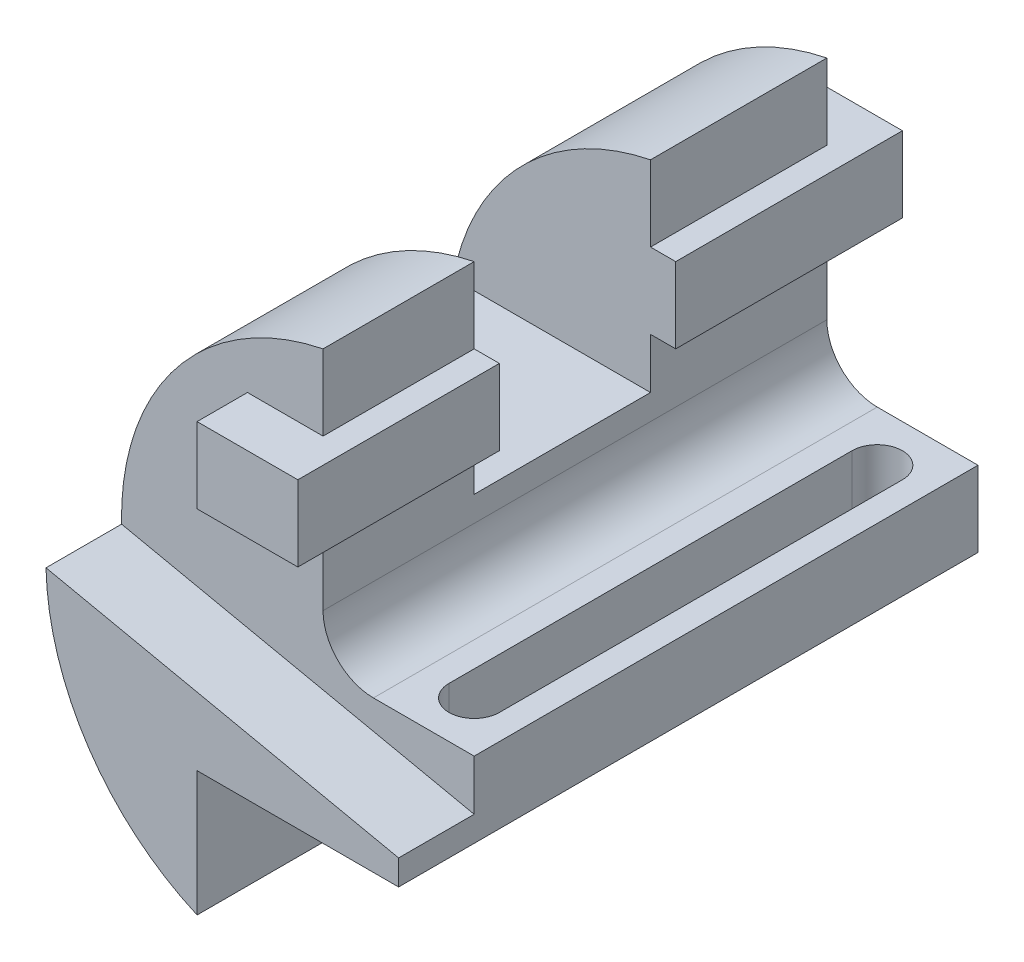
ISO-10303-21;
HEADER;
FILE_DESCRIPTION(('STEP AP214'),'2;1');
FILE_NAME('part.step','',(''),(''),'','','');
FILE_SCHEMA(('AUTOMOTIVE_DESIGN { 1 0 10303 214 1 1 1 1 }'));
ENDSEC;
DATA;
#1=APPLICATION_CONTEXT('core data for automotive mechanical design processes');
#2=APPLICATION_PROTOCOL_DEFINITION('international standard','automotive_design',2000,#1);
#3=PRODUCT_CONTEXT('',#1,'mechanical');
#4=PRODUCT('Part','Part','',(#3));
#5=PRODUCT_RELATED_PRODUCT_CATEGORY('part','',(#4));
#6=PRODUCT_DEFINITION_FORMATION('','',#4);
#7=PRODUCT_DEFINITION_CONTEXT('part definition',#1,'design');
#8=PRODUCT_DEFINITION('design','',#6,#7);
#9=PRODUCT_DEFINITION_SHAPE('','',#8);
#10=(LENGTH_UNIT() NAMED_UNIT(*) SI_UNIT(.MILLI.,.METRE.));
#11=(NAMED_UNIT(*) PLANE_ANGLE_UNIT() SI_UNIT($,.RADIAN.));
#12=(NAMED_UNIT(*) SI_UNIT($,.STERADIAN.) SOLID_ANGLE_UNIT());
#13=UNCERTAINTY_MEASURE_WITH_UNIT(LENGTH_MEASURE(1.E-05),#10,'distance_accuracy_value','');
#14=(GEOMETRIC_REPRESENTATION_CONTEXT(3) GLOBAL_UNCERTAINTY_ASSIGNED_CONTEXT((#13)) GLOBAL_UNIT_ASSIGNED_CONTEXT((#10,
#11,#12)) REPRESENTATION_CONTEXT('',''));
#15=CARTESIAN_POINT('',(0.,0.,0.));
#16=DIRECTION('',(0.,0.,1.));
#17=DIRECTION('',(1.,0.,0.));
#18=AXIS2_PLACEMENT_3D('',#15,#16,#17);
#19=CARTESIAN_POINT('',(-30.,25.0000000000001,115.));
#20=DIRECTION('',(-1.,0.,0.));
#21=DIRECTION('',(0.,-1.,0.));
#22=AXIS2_PLACEMENT_3D('',#19,#20,#21);
#23=PLANE('',#22);
#24=DIRECTION('',(0.,0.,1.));
#25=VECTOR('',#24,1.);
#26=CARTESIAN_POINT('',(-30.,55.,115.));
#27=LINE('',#26,#25);
#28=CARTESIAN_POINT('',(-30.,55.,70.));
#29=VERTEX_POINT('',#28);
#30=CARTESIAN_POINT('',(-30.,55.,100.));
#31=VERTEX_POINT('',#30);
#32=EDGE_CURVE('E328',#29,#31,#27,.T.);
#33=ORIENTED_EDGE('',*,*,#32,.F.);
#34=DIRECTION('',(0.,1.,0.));
#35=VECTOR('',#34,1.);
#36=CARTESIAN_POINT('',(-30.,25.0000000000001,70.));
#37=LINE('',#36,#35);
#38=CARTESIAN_POINT('',(-29.9999999999999,70.,70.));
#39=VERTEX_POINT('',#38);
#40=EDGE_CURVE('E276',#29,#39,#37,.T.);
#41=ORIENTED_EDGE('',*,*,#40,.T.);
#42=DIRECTION('',(0.,0.,-1.));
#43=VECTOR('',#42,1.);
#44=CARTESIAN_POINT('',(-30.,70.,115.));
#45=LINE('',#44,#43);
#46=CARTESIAN_POINT('',(-30.,70.,100.));
#47=VERTEX_POINT('',#46);
#48=EDGE_CURVE('E405',#47,#39,#45,.T.);
#49=ORIENTED_EDGE('',*,*,#48,.F.);
#50=DIRECTION('',(0.,1.,0.));
#51=VECTOR('',#50,1.);
#52=CARTESIAN_POINT('',(-30.,25.0000000000001,100.));
#53=LINE('',#52,#51);
#54=EDGE_CURVE('E352',#31,#47,#53,.T.);
#55=ORIENTED_EDGE('',*,*,#54,.F.);
#56=EDGE_LOOP('',(#33,#41,#49,#55));
#57=FACE_BOUND('',#56,.T.);
#58=ADVANCED_FACE('F39',(#57),#23,.F.);
#59=CARTESIAN_POINT('',(-25.,55.,-10.));
#60=DIRECTION('',(-1.,0.,0.));
#61=DIRECTION('',(0.,-1.,0.));
#62=AXIS2_PLACEMENT_3D('',#59,#60,#61);
#63=PLANE('',#62);
#64=DIRECTION('',(0.,0.,1.));
#65=VECTOR('',#64,1.);
#66=CARTESIAN_POINT('',(-25.,40.,-10.));
#67=LINE('',#66,#65);
#68=CARTESIAN_POINT('',(-25.,40.,70.));
#69=VERTEX_POINT('',#68);
#70=CARTESIAN_POINT('',(-25.,40.,110.));
#71=VERTEX_POINT('',#70);
#72=EDGE_CURVE('E324',#69,#71,#67,.T.);
#73=ORIENTED_EDGE('',*,*,#72,.F.);
#74=DIRECTION('',(0.,1.,0.));
#75=VECTOR('',#74,1.);
#76=CARTESIAN_POINT('',(-25.,55.,70.));
#77=LINE('',#76,#75);
#78=CARTESIAN_POINT('',(-25.,55.,70.));
#79=VERTEX_POINT('',#78);
#80=EDGE_CURVE('E273',#69,#79,#77,.T.);
#81=ORIENTED_EDGE('',*,*,#80,.T.);
#82=DIRECTION('',(0.,0.,1.));
#83=VECTOR('',#82,1.);
#84=CARTESIAN_POINT('',(-25.,55.,-10.));
#85=LINE('',#84,#83);
#86=CARTESIAN_POINT('',(-25.,55.,110.));
#87=VERTEX_POINT('',#86);
#88=EDGE_CURVE('E312',#79,#87,#85,.T.);
#89=ORIENTED_EDGE('',*,*,#88,.T.);
#90=DIRECTION('',(0.,1.,0.));
#91=VECTOR('',#90,1.);
#92=CARTESIAN_POINT('',(-25.,55.,110.));
#93=LINE('',#92,#91);
#94=EDGE_CURVE('E297',#71,#87,#93,.T.);
#95=ORIENTED_EDGE('',*,*,#94,.F.);
#96=EDGE_LOOP('',(#73,#81,#89,#95));
#97=FACE_BOUND('',#96,.T.);
#98=ADVANCED_FACE('F455',(#97),#63,.F.);
#99=CARTESIAN_POINT('',(-25.,40.,-10.));
#100=DIRECTION('',(0.,1.,0.));
#101=DIRECTION('',(0.,0.,1.));
#102=AXIS2_PLACEMENT_3D('',#99,#100,#101);
#103=PLANE('',#102);
#104=DIRECTION('',(0.,0.,-1.));
#105=VECTOR('',#104,1.);
#106=CARTESIAN_POINT('',(-30.,40.,115.));
#107=LINE('',#106,#105);
#108=CARTESIAN_POINT('',(-30.,40.,100.));
#109=VERTEX_POINT('',#108);
#110=CARTESIAN_POINT('',(-30.,40.,70.));
#111=VERTEX_POINT('',#110);
#112=EDGE_CURVE('E339',#109,#111,#107,.T.);
#113=ORIENTED_EDGE('',*,*,#112,.T.);
#114=DIRECTION('',(1.,0.,0.));
#115=VECTOR('',#114,1.);
#116=CARTESIAN_POINT('',(-25.,40.,70.));
#117=LINE('',#116,#115);
#118=EDGE_CURVE('E279',#111,#69,#117,.T.);
#119=ORIENTED_EDGE('',*,*,#118,.T.);
#120=ORIENTED_EDGE('',*,*,#72,.T.);
#121=DIRECTION('',(1.,0.,0.));
#122=VECTOR('',#121,1.);
#123=CARTESIAN_POINT('',(-25.,40.,110.));
#124=LINE('',#123,#122);
#125=CARTESIAN_POINT('',(-45.,40.,110.));
#126=VERTEX_POINT('',#125);
#127=EDGE_CURVE('E300',#126,#71,#124,.T.);
#128=ORIENTED_EDGE('',*,*,#127,.F.);
#129=DIRECTION('',(0.,0.,1.));
#130=VECTOR('',#129,1.);
#131=CARTESIAN_POINT('',(-45.,40.,-10.));
#132=LINE('',#131,#130);
#133=CARTESIAN_POINT('',(-45.,40.,100.));
#134=VERTEX_POINT('',#133);
#135=EDGE_CURVE('E320',#134,#126,#132,.T.);
#136=ORIENTED_EDGE('',*,*,#135,.F.);
#137=DIRECTION('',(-1.,0.,0.));
#138=VECTOR('',#137,1.);
#139=CARTESIAN_POINT('',(-20.,40.,100.));
#140=LINE('',#139,#138);
#141=EDGE_CURVE('E420',#109,#134,#140,.T.);
#142=ORIENTED_EDGE('',*,*,#141,.F.);
#143=EDGE_LOOP('',(#113,#119,#120,#128,#136,#142));
#144=FACE_BOUND('',#143,.T.);
#145=ADVANCED_FACE('F463',(#144),#103,.F.);
#146=CARTESIAN_POINT('',(-25.,55.,-10.));
#147=DIRECTION('',(0.,-1.,0.));
#148=DIRECTION('',(0.,0.,-1.));
#149=AXIS2_PLACEMENT_3D('',#146,#147,#148);
#150=PLANE('',#149);
#151=ORIENTED_EDGE('',*,*,#88,.F.);
#152=DIRECTION('',(-1.,0.,0.));
#153=VECTOR('',#152,1.);
#154=CARTESIAN_POINT('',(-25.,55.,70.));
#155=LINE('',#154,#153);
#156=EDGE_CURVE('E426',#79,#29,#155,.T.);
#157=ORIENTED_EDGE('',*,*,#156,.T.);
#158=ORIENTED_EDGE('',*,*,#32,.T.);
#159=DIRECTION('',(1.,0.,0.));
#160=VECTOR('',#159,1.);
#161=CARTESIAN_POINT('',(-20.,55.,100.));
#162=LINE('',#161,#160);
#163=CARTESIAN_POINT('',(-45.,55.,100.));
#164=VERTEX_POINT('',#163);
#165=EDGE_CURVE('E414',#164,#31,#162,.T.);
#166=ORIENTED_EDGE('',*,*,#165,.F.);
#167=DIRECTION('',(0.,0.,1.));
#168=VECTOR('',#167,1.);
#169=CARTESIAN_POINT('',(-45.,55.,-10.));
#170=LINE('',#169,#168);
#171=CARTESIAN_POINT('',(-45.,55.,110.));
#172=VERTEX_POINT('',#171);
#173=EDGE_CURVE('E316',#164,#172,#170,.T.);
#174=ORIENTED_EDGE('',*,*,#173,.T.);
#175=DIRECTION('',(-1.,0.,0.));
#176=VECTOR('',#175,1.);
#177=CARTESIAN_POINT('',(-25.,55.,110.));
#178=LINE('',#177,#176);
#179=EDGE_CURVE('E294',#87,#172,#178,.T.);
#180=ORIENTED_EDGE('',*,*,#179,.F.);
#181=EDGE_LOOP('',(#151,#157,#158,#166,#174,#180));
#182=FACE_BOUND('',#181,.T.);
#183=ADVANCED_FACE('F474',(#182),#150,.F.);
#184=DIRECTION('',(0.,0.,1.));
#185=VECTOR('',#184,1.);
#186=CARTESIAN_POINT('',(-30.,30.,115.));
#187=LINE('',#186,#185);
#188=CARTESIAN_POINT('',(-30.,30.,35.));
#189=VERTEX_POINT('',#188);
#190=CARTESIAN_POINT('',(-30.,30.,70.));
#191=VERTEX_POINT('',#190);
#192=EDGE_CURVE('E288',#189,#191,#187,.T.);
#193=ORIENTED_EDGE('',*,*,#192,.T.);
#194=DIRECTION('',(0.,1.,0.));
#195=VECTOR('',#194,1.);
#196=CARTESIAN_POINT('',(-30.,25.0000000000001,70.));
#197=LINE('',#196,#195);
#198=EDGE_CURVE('E285',#191,#111,#197,.T.);
#199=ORIENTED_EDGE('',*,*,#198,.T.);
#200=ORIENTED_EDGE('',*,*,#112,.F.);
#201=CARTESIAN_POINT('',(-30.,25.0000000000001,100.));
#202=VERTEX_POINT('',#201);
#203=EDGE_CURVE('E353',#202,#109,#53,.T.);
#204=ORIENTED_EDGE('',*,*,#203,.F.);
#205=DIRECTION('',(0.,0.,-1.));
#206=VECTOR('',#205,1.);
#207=CARTESIAN_POINT('',(-30.,25.0000000000001,115.));
#208=LINE('',#207,#206);
#209=CARTESIAN_POINT('',(-30.,25.0000000000001,0.));
#210=VERTEX_POINT('',#209);
#211=EDGE_CURVE('E408',#202,#210,#208,.T.);
#212=ORIENTED_EDGE('',*,*,#211,.T.);
#213=DIRECTION('',(0.,1.,0.));
#214=VECTOR('',#213,1.);
#215=CARTESIAN_POINT('',(-30.,25.0000000000001,0.));
#216=LINE('',#215,#214);
#217=CARTESIAN_POINT('',(-30.,40.,0.));
#218=VERTEX_POINT('',#217);
#219=EDGE_CURVE('E388',#210,#218,#216,.T.);
#220=ORIENTED_EDGE('',*,*,#219,.T.);
#221=CARTESIAN_POINT('',(-30.,40.,35.));
#222=VERTEX_POINT('',#221);
#223=EDGE_CURVE('E338',#222,#218,#107,.T.);
#224=ORIENTED_EDGE('',*,*,#223,.F.);
#225=DIRECTION('',(0.,-1.,0.));
#226=VECTOR('',#225,1.);
#227=CARTESIAN_POINT('',(-30.,25.0000000000001,35.));
#228=LINE('',#227,#226);
#229=EDGE_CURVE('E270',#222,#189,#228,.T.);
#230=ORIENTED_EDGE('',*,*,#229,.T.);
#231=EDGE_LOOP('',(#193,#199,#200,#204,#212,#220,#224,#230));
#232=FACE_BOUND('',#231,.T.);
#233=ADVANCED_FACE('F459',(#232),#23,.F.);
#234=CARTESIAN_POINT('',(-30.,70.,35.));
#235=VERTEX_POINT('',#234);
#236=CARTESIAN_POINT('',(-30.,70.,0.));
#237=VERTEX_POINT('',#236);
#238=EDGE_CURVE('E404',#235,#237,#45,.T.);
#239=ORIENTED_EDGE('',*,*,#238,.F.);
#240=DIRECTION('',(0.,-1.,0.));
#241=VECTOR('',#240,1.);
#242=CARTESIAN_POINT('',(-30.,25.0000000000001,35.));
#243=LINE('',#242,#241);
#244=CARTESIAN_POINT('',(-30.,55.,35.));
#245=VERTEX_POINT('',#244);
#246=EDGE_CURVE('E261',#235,#245,#243,.T.);
#247=ORIENTED_EDGE('',*,*,#246,.T.);
#248=CARTESIAN_POINT('',(-30.,55.,0.));
#249=VERTEX_POINT('',#248);
#250=EDGE_CURVE('E329',#249,#245,#27,.T.);
#251=ORIENTED_EDGE('',*,*,#250,.F.);
#252=EDGE_CURVE('E387',#249,#237,#216,.T.);
#253=ORIENTED_EDGE('',*,*,#252,.T.);
#254=EDGE_LOOP('',(#239,#247,#251,#253));
#255=FACE_BOUND('',#254,.T.);
#256=ADVANCED_FACE('F458',(#255),#23,.F.);
#257=CARTESIAN_POINT('',(-20.,25.,0.));
#258=DIRECTION('',(0.,0.,-1.));
#259=DIRECTION('',(-1.,0.,0.));
#260=AXIS2_PLACEMENT_3D('',#257,#258,#259);
#261=PLANE('',#260);
#262=DIRECTION('',(0.,-1.,0.));
#263=VECTOR('',#262,1.);
#264=CARTESIAN_POINT('',(-45.,25.,0.));
#265=LINE('',#264,#263);
#266=CARTESIAN_POINT('',(-45.,55.,0.));
#267=VERTEX_POINT('',#266);
#268=CARTESIAN_POINT('',(-45.,40.,0.));
#269=VERTEX_POINT('',#268);
#270=EDGE_CURVE('E335',#267,#269,#265,.T.);
#271=ORIENTED_EDGE('',*,*,#270,.T.);
#272=DIRECTION('',(1.,0.,0.));
#273=VECTOR('',#272,1.);
#274=CARTESIAN_POINT('',(-20.,40.,0.));
#275=LINE('',#274,#273);
#276=EDGE_CURVE('E342',#269,#218,#275,.T.);
#277=ORIENTED_EDGE('',*,*,#276,.T.);
#278=ORIENTED_EDGE('',*,*,#219,.F.);
#279=CARTESIAN_POINT('',(-20.,25.,0.));
#280=DIRECTION('',(0.,0.,-1.));
#281=DIRECTION('',(-1.,0.,0.));
#282=AXIS2_PLACEMENT_3D('',#279,#280,#281);
#283=CIRCLE('',#282,10.);
#284=CARTESIAN_POINT('',(-19.9999999999999,15.,0.));
#285=VERTEX_POINT('',#284);
#286=EDGE_CURVE('E384',#285,#210,#283,.T.);
#287=ORIENTED_EDGE('',*,*,#286,.F.);
#288=DIRECTION('',(-1.,0.,0.));
#289=VECTOR('',#288,1.);
#290=CARTESIAN_POINT('',(0.,15.,0.));
#291=LINE('',#290,#289);
#292=CARTESIAN_POINT('',(0.,15.,0.));
#293=VERTEX_POINT('',#292);
#294=EDGE_CURVE('E381',#293,#285,#291,.T.);
#295=ORIENTED_EDGE('',*,*,#294,.F.);
#296=DIRECTION('',(0.,1.,0.));
#297=VECTOR('',#296,1.);
#298=CARTESIAN_POINT('',(0.,0.,0.));
#299=LINE('',#298,#297);
#300=CARTESIAN_POINT('',(0.,0.,0.));
#301=VERTEX_POINT('',#300);
#302=EDGE_CURVE('E366',#301,#293,#299,.T.);
#303=ORIENTED_EDGE('',*,*,#302,.F.);
#304=DIRECTION('',(1.,0.,0.));
#305=VECTOR('',#304,1.);
#306=CARTESIAN_POINT('',(0.,0.,0.));
#307=LINE('',#306,#305);
#308=CARTESIAN_POINT('',(-40.,0.,0.));
#309=VERTEX_POINT('',#308);
#310=EDGE_CURVE('E372',#309,#301,#307,.T.);
#311=ORIENTED_EDGE('',*,*,#310,.F.);
#312=DIRECTION('',(0.,1.,0.));
#313=VECTOR('',#312,1.);
#314=CARTESIAN_POINT('',(-40.,0.,0.));
#315=LINE('',#314,#313);
#316=CARTESIAN_POINT('',(-40.,-24.815551805222,0.));
#317=VERTEX_POINT('',#316);
#318=EDGE_CURVE('E393',#317,#309,#315,.T.);
#319=ORIENTED_EDGE('',*,*,#318,.F.);
#320=CARTESIAN_POINT('',(-20.,21.0102051443364,0.));
#321=DIRECTION('',(0.,0.,1.));
#322=DIRECTION('',(1.,0.,0.));
#323=AXIS2_PLACEMENT_3D('',#320,#321,#322);
#324=CIRCLE('',#323,50.);
#325=EDGE_CURVE('E391',#237,#317,#324,.T.);
#326=ORIENTED_EDGE('',*,*,#325,.F.);
#327=ORIENTED_EDGE('',*,*,#252,.F.);
#328=DIRECTION('',(-1.,0.,0.));
#329=VECTOR('',#328,1.);
#330=CARTESIAN_POINT('',(-20.,55.,0.));
#331=LINE('',#330,#329);
#332=EDGE_CURVE('E332',#249,#267,#331,.T.);
#333=ORIENTED_EDGE('',*,*,#332,.T.);
#334=EDGE_LOOP('',(#271,#277,#278,#287,#295,#303,#311,#319,#326,#327,#333));
#335=FACE_BOUND('',#334,.T.);
#336=ADVANCED_FACE('F471',(#335),#261,.T.);
#337=CARTESIAN_POINT('',(-20.,25.,100.));
#338=DIRECTION('',(0.,0.,1.));
#339=DIRECTION('',(1.,0.,0.));
#340=AXIS2_PLACEMENT_3D('',#337,#338,#339);
#341=PLANE('',#340);
#342=ORIENTED_EDGE('',*,*,#203,.T.);
#343=ORIENTED_EDGE('',*,*,#141,.T.);
#344=DIRECTION('',(0.,1.,0.));
#345=VECTOR('',#344,1.);
#346=CARTESIAN_POINT('',(-45.,25.,100.));
#347=LINE('',#346,#345);
#348=EDGE_CURVE('E417',#134,#164,#347,.T.);
#349=ORIENTED_EDGE('',*,*,#348,.T.);
#350=ORIENTED_EDGE('',*,*,#165,.T.);
#351=ORIENTED_EDGE('',*,*,#54,.T.);
#352=CARTESIAN_POINT('',(-20.,21.0102051443364,100.));
#353=DIRECTION('',(0.,0.,1.));
#354=DIRECTION('',(1.,0.,0.));
#355=AXIS2_PLACEMENT_3D('',#352,#353,#354);
#356=CIRCLE('',#355,50.);
#357=CARTESIAN_POINT('',(-69.987139251767,19.8762256804764,100.));
#358=VERTEX_POINT('',#357);
#359=EDGE_CURVE('E356',#47,#358,#356,.T.);
#360=ORIENTED_EDGE('',*,*,#359,.T.);
#361=DIRECTION('',(0.978147600733806,-0.207911690817756,0.));
#362=VECTOR('',#361,1.);
#363=CARTESIAN_POINT('',(0.,5.,100.));
#364=LINE('',#363,#362);
#365=CARTESIAN_POINT('',(0.,5.,100.));
#366=VERTEX_POINT('',#365);
#367=EDGE_CURVE('E358',#358,#366,#364,.T.);
#368=ORIENTED_EDGE('',*,*,#367,.T.);
#369=DIRECTION('',(0.,1.,0.));
#370=VECTOR('',#369,1.);
#371=CARTESIAN_POINT('',(0.,5.,100.));
#372=LINE('',#371,#370);
#373=CARTESIAN_POINT('',(0.,15.,100.));
#374=VERTEX_POINT('',#373);
#375=EDGE_CURVE('E346',#366,#374,#372,.T.);
#376=ORIENTED_EDGE('',*,*,#375,.T.);
#377=DIRECTION('',(-1.,0.,0.));
#378=VECTOR('',#377,1.);
#379=CARTESIAN_POINT('',(0.,15.,100.));
#380=LINE('',#379,#378);
#381=CARTESIAN_POINT('',(-19.9999999999999,15.,100.));
#382=VERTEX_POINT('',#381);
#383=EDGE_CURVE('E348',#374,#382,#380,.T.);
#384=ORIENTED_EDGE('',*,*,#383,.T.);
#385=CARTESIAN_POINT('',(-20.,25.,100.));
#386=DIRECTION('',(0.,0.,-1.));
#387=DIRECTION('',(1.,0.,0.));
#388=AXIS2_PLACEMENT_3D('',#385,#386,#387);
#389=CIRCLE('',#388,10.);
#390=EDGE_CURVE('E350',#382,#202,#389,.T.);
#391=ORIENTED_EDGE('',*,*,#390,.T.);
#392=EDGE_LOOP('',(#342,#343,#349,#350,#351,#360,#368,#376,#384,#391));
#393=FACE_BOUND('',#392,.T.);
#394=ADVANCED_FACE('F517',(#393),#341,.T.);
#395=CARTESIAN_POINT('',(0.,15.,115.));
#396=DIRECTION('',(0.,-1.,0.));
#397=DIRECTION('',(1.,0.,0.));
#398=AXIS2_PLACEMENT_3D('',#395,#396,#397);
#399=PLANE('',#398);
#400=DIRECTION('',(0.,0.,1.));
#401=VECTOR('',#400,1.);
#402=CARTESIAN_POINT('',(-15.,15.,10.));
#403=LINE('',#402,#401);
#404=CARTESIAN_POINT('',(-15.,15.,10.));
#405=VERTEX_POINT('',#404);
#406=CARTESIAN_POINT('',(-15.,15.,90.));
#407=VERTEX_POINT('',#406);
#408=EDGE_CURVE('E236',#405,#407,#403,.T.);
#409=ORIENTED_EDGE('',*,*,#408,.F.);
#410=CARTESIAN_POINT('',(-10.,15.,10.));
#411=DIRECTION('',(0.,1.,0.));
#412=DIRECTION('',(-1.,0.,0.));
#413=AXIS2_PLACEMENT_3D('',#410,#411,#412);
#414=CIRCLE('',#413,5.);
#415=CARTESIAN_POINT('',(-5.,15.,10.));
#416=VERTEX_POINT('',#415);
#417=EDGE_CURVE('E54',#416,#405,#414,.T.);
#418=ORIENTED_EDGE('',*,*,#417,.F.);
#419=DIRECTION('',(0.,0.,-1.));
#420=VECTOR('',#419,1.);
#421=CARTESIAN_POINT('',(-5.,15.,10.));
#422=LINE('',#421,#420);
#423=CARTESIAN_POINT('',(-4.99999999999999,15.,90.));
#424=VERTEX_POINT('',#423);
#425=EDGE_CURVE('E243',#424,#416,#422,.T.);
#426=ORIENTED_EDGE('',*,*,#425,.F.);
#427=CARTESIAN_POINT('',(-9.99999999999999,15.,90.));
#428=DIRECTION('',(0.,1.,0.));
#429=DIRECTION('',(-1.,0.,0.));
#430=AXIS2_PLACEMENT_3D('',#427,#428,#429);
#431=CIRCLE('',#430,5.);
#432=EDGE_CURVE('E227',#407,#424,#431,.T.);
#433=ORIENTED_EDGE('',*,*,#432,.F.);
#434=EDGE_LOOP('',(#409,#418,#426,#433));
#435=FACE_BOUND('',#434,.T.);
#436=ORIENTED_EDGE('',*,*,#383,.F.);
#437=DIRECTION('',(0.,0.,-1.));
#438=VECTOR('',#437,1.);
#439=CARTESIAN_POINT('',(0.,15.,115.));
#440=LINE('',#439,#438);
#441=EDGE_CURVE('E412',#374,#293,#440,.T.);
#442=ORIENTED_EDGE('',*,*,#441,.T.);
#443=ORIENTED_EDGE('',*,*,#294,.T.);
#444=DIRECTION('',(0.,0.,-1.));
#445=VECTOR('',#444,1.);
#446=CARTESIAN_POINT('',(-19.9999999999999,15.,115.));
#447=LINE('',#446,#445);
#448=EDGE_CURVE('E410',#382,#285,#447,.T.);
#449=ORIENTED_EDGE('',*,*,#448,.F.);
#450=EDGE_LOOP('',(#436,#442,#443,#449));
#451=FACE_BOUND('',#450,.T.);
#452=ADVANCED_FACE('F240',(#435,#451),#399,.F.);
#453=CARTESIAN_POINT('',(-20.,25.,115.));
#454=DIRECTION('',(0.,0.,-1.));
#455=DIRECTION('',(-1.,0.,0.));
#456=AXIS2_PLACEMENT_3D('',#453,#454,#455);
#457=CYLINDRICAL_SURFACE('',#456,10.);
#458=ORIENTED_EDGE('',*,*,#390,.F.);
#459=ORIENTED_EDGE('',*,*,#448,.T.);
#460=ORIENTED_EDGE('',*,*,#286,.T.);
#461=ORIENTED_EDGE('',*,*,#211,.F.);
#462=EDGE_LOOP('',(#458,#459,#460,#461));
#463=FACE_BOUND('',#462,.T.);
#464=ADVANCED_FACE('F530',(#463),#457,.F.);
#465=CARTESIAN_POINT('',(0.,0.,115.));
#466=DIRECTION('',(-1.,0.,0.));
#467=DIRECTION('',(0.,0.,1.));
#468=AXIS2_PLACEMENT_3D('',#465,#466,#467);
#469=PLANE('',#468);
#470=ORIENTED_EDGE('',*,*,#375,.F.);
#471=DIRECTION('',(0.,0.,1.));
#472=VECTOR('',#471,1.);
#473=CARTESIAN_POINT('',(0.,5.,100.));
#474=LINE('',#473,#472);
#475=CARTESIAN_POINT('',(0.,5.,115.));
#476=VERTEX_POINT('',#475);
#477=EDGE_CURVE('E363',#366,#476,#474,.T.);
#478=ORIENTED_EDGE('',*,*,#477,.T.);
#479=DIRECTION('',(0.,1.,0.));
#480=VECTOR('',#479,1.);
#481=CARTESIAN_POINT('',(0.,0.,115.));
#482=LINE('',#481,#480);
#483=CARTESIAN_POINT('',(0.,0.,115.));
#484=VERTEX_POINT('',#483);
#485=EDGE_CURVE('E368',#484,#476,#482,.T.);
#486=ORIENTED_EDGE('',*,*,#485,.F.);
#487=DIRECTION('',(0.,0.,-1.));
#488=VECTOR('',#487,1.);
#489=CARTESIAN_POINT('',(0.,0.,115.));
#490=LINE('',#489,#488);
#491=EDGE_CURVE('E378',#484,#301,#490,.T.);
#492=ORIENTED_EDGE('',*,*,#491,.T.);
#493=ORIENTED_EDGE('',*,*,#302,.T.);
#494=ORIENTED_EDGE('',*,*,#441,.F.);
#495=EDGE_LOOP('',(#470,#478,#486,#492,#493,#494));
#496=FACE_BOUND('',#495,.T.);
#497=ADVANCED_FACE('F41',(#496),#469,.F.);
#498=CARTESIAN_POINT('',(-20.,21.0102051443364,115.));
#499=DIRECTION('',(0.,0.,-1.));
#500=DIRECTION('',(-1.,0.,0.));
#501=AXIS2_PLACEMENT_3D('',#498,#499,#500);
#502=CYLINDRICAL_SURFACE('',#501,50.);
#503=ORIENTED_EDGE('',*,*,#48,.T.);
#504=CARTESIAN_POINT('',(-20.,21.0102051443364,70.));
#505=DIRECTION('',(0.,0.,1.));
#506=DIRECTION('',(1.,0.,0.));
#507=AXIS2_PLACEMENT_3D('',#504,#505,#506);
#508=CIRCLE('',#507,50.);
#509=CARTESIAN_POINT('',(-69.185196842679,30.,70.));
#510=VERTEX_POINT('',#509);
#511=EDGE_CURVE('E282',#39,#510,#508,.T.);
#512=ORIENTED_EDGE('',*,*,#511,.T.);
#513=DIRECTION('',(0.,0.,-1.));
#514=VECTOR('',#513,1.);
#515=CARTESIAN_POINT('',(-69.185196842679,30.,115.));
#516=LINE('',#515,#514);
#517=CARTESIAN_POINT('',(-69.185196842679,30.,35.));
#518=VERTEX_POINT('',#517);
#519=EDGE_CURVE('E429',#510,#518,#516,.T.);
#520=ORIENTED_EDGE('',*,*,#519,.T.);
#521=CARTESIAN_POINT('',(-20.,21.0102051443364,35.));
#522=DIRECTION('',(0.,0.,-1.));
#523=DIRECTION('',(0.,1.,0.));
#524=AXIS2_PLACEMENT_3D('',#521,#522,#523);
#525=CIRCLE('',#524,50.);
#526=EDGE_CURVE('E267',#518,#235,#525,.T.);
#527=ORIENTED_EDGE('',*,*,#526,.T.);
#528=ORIENTED_EDGE('',*,*,#238,.T.);
#529=ORIENTED_EDGE('',*,*,#325,.T.);
#530=DIRECTION('',(0.,0.,-1.));
#531=VECTOR('',#530,1.);
#532=CARTESIAN_POINT('',(-40.,-24.815551805222,115.));
#533=LINE('',#532,#531);
#534=CARTESIAN_POINT('',(-40.,-24.815551805222,115.));
#535=VERTEX_POINT('',#534);
#536=EDGE_CURVE('E401',#535,#317,#533,.T.);
#537=ORIENTED_EDGE('',*,*,#536,.F.);
#538=CARTESIAN_POINT('',(-20.,21.0102051443364,115.));
#539=DIRECTION('',(0.,0.,1.));
#540=DIRECTION('',(1.,0.,0.));
#541=AXIS2_PLACEMENT_3D('',#538,#539,#540);
#542=CIRCLE('',#541,50.);
#543=CARTESIAN_POINT('',(-69.987139251767,19.8762256804764,115.));
#544=VERTEX_POINT('',#543);
#545=EDGE_CURVE('E371',#544,#535,#542,.T.);
#546=ORIENTED_EDGE('',*,*,#545,.F.);
#547=DIRECTION('',(0.,0.,1.));
#548=VECTOR('',#547,1.);
#549=CARTESIAN_POINT('',(-69.987139251767,19.8762256804764,100.));
#550=LINE('',#549,#548);
#551=EDGE_CURVE('E361',#358,#544,#550,.T.);
#552=ORIENTED_EDGE('',*,*,#551,.F.);
#553=ORIENTED_EDGE('',*,*,#359,.F.);
#554=EDGE_LOOP('',(#503,#512,#520,#527,#528,#529,#537,#546,#552,#553));
#555=FACE_BOUND('',#554,.T.);
#556=ADVANCED_FACE('F490',(#555),#502,.T.);
#557=CARTESIAN_POINT('',(-40.,0.,115.));
#558=DIRECTION('',(-1.,0.,0.));
#559=DIRECTION('',(0.,-1.,0.));
#560=AXIS2_PLACEMENT_3D('',#557,#558,#559);
#561=PLANE('',#560);
#562=ORIENTED_EDGE('',*,*,#318,.T.);
#563=DIRECTION('',(0.,0.,-1.));
#564=VECTOR('',#563,1.);
#565=CARTESIAN_POINT('',(-40.,0.,115.));
#566=LINE('',#565,#564);
#567=CARTESIAN_POINT('',(-40.,0.,115.));
#568=VERTEX_POINT('',#567);
#569=EDGE_CURVE('E398',#568,#309,#566,.T.);
#570=ORIENTED_EDGE('',*,*,#569,.F.);
#571=DIRECTION('',(0.,1.,0.));
#572=VECTOR('',#571,1.);
#573=CARTESIAN_POINT('',(-40.,0.,115.));
#574=LINE('',#573,#572);
#575=EDGE_CURVE('E374',#535,#568,#574,.T.);
#576=ORIENTED_EDGE('',*,*,#575,.F.);
#577=ORIENTED_EDGE('',*,*,#536,.T.);
#578=EDGE_LOOP('',(#562,#570,#576,#577));
#579=FACE_BOUND('',#578,.T.);
#580=ADVANCED_FACE('F502',(#579),#561,.F.);
#581=CARTESIAN_POINT('',(0.,0.,115.));
#582=DIRECTION('',(0.,1.,0.));
#583=DIRECTION('',(0.,0.,1.));
#584=AXIS2_PLACEMENT_3D('',#581,#582,#583);
#585=PLANE('',#584);
#586=DIRECTION('',(0.,0.,-1.));
#587=VECTOR('',#586,1.);
#588=CARTESIAN_POINT('',(-4.99999999999999,0.,115.));
#589=LINE('',#588,#587);
#590=CARTESIAN_POINT('',(-4.99999999999999,0.,90.));
#591=VERTEX_POINT('',#590);
#592=CARTESIAN_POINT('',(-5.,0.,10.));
#593=VERTEX_POINT('',#592);
#594=EDGE_CURVE('E47',#591,#593,#589,.T.);
#595=ORIENTED_EDGE('',*,*,#594,.T.);
#596=CARTESIAN_POINT('',(-10.,0.,10.));
#597=DIRECTION('',(0.,1.,0.));
#598=DIRECTION('',(0.,0.,1.));
#599=AXIS2_PLACEMENT_3D('',#596,#597,#598);
#600=CIRCLE('',#599,5.);
#601=CARTESIAN_POINT('',(-15.,0.,10.));
#602=VERTEX_POINT('',#601);
#603=EDGE_CURVE('E12',#593,#602,#600,.T.);
#604=ORIENTED_EDGE('',*,*,#603,.T.);
#605=DIRECTION('',(0.,0.,1.));
#606=VECTOR('',#605,1.);
#607=CARTESIAN_POINT('',(-15.,0.,115.));
#608=LINE('',#607,#606);
#609=CARTESIAN_POINT('',(-15.,0.,90.));
#610=VERTEX_POINT('',#609);
#611=EDGE_CURVE('E432',#602,#610,#608,.T.);
#612=ORIENTED_EDGE('',*,*,#611,.T.);
#613=CARTESIAN_POINT('',(-9.99999999999999,0.,90.));
#614=DIRECTION('',(0.,1.,0.));
#615=DIRECTION('',(0.,0.,1.));
#616=AXIS2_PLACEMENT_3D('',#613,#614,#615);
#617=CIRCLE('',#616,5.);
#618=EDGE_CURVE('E230',#610,#591,#617,.T.);
#619=ORIENTED_EDGE('',*,*,#618,.T.);
#620=EDGE_LOOP('',(#595,#604,#612,#619));
#621=FACE_BOUND('',#620,.T.);
#622=ORIENTED_EDGE('',*,*,#310,.T.);
#623=ORIENTED_EDGE('',*,*,#491,.F.);
#624=DIRECTION('',(1.,0.,0.));
#625=VECTOR('',#624,1.);
#626=CARTESIAN_POINT('',(0.,0.,115.));
#627=LINE('',#626,#625);
#628=EDGE_CURVE('E376',#568,#484,#627,.T.);
#629=ORIENTED_EDGE('',*,*,#628,.F.);
#630=ORIENTED_EDGE('',*,*,#569,.T.);
#631=EDGE_LOOP('',(#622,#623,#629,#630));
#632=FACE_BOUND('',#631,.T.);
#633=ADVANCED_FACE('F436',(#621,#632),#585,.F.);
#634=CARTESIAN_POINT('',(-20.,25.,115.));
#635=DIRECTION('',(0.,0.,-1.));
#636=DIRECTION('',(-1.,0.,0.));
#637=AXIS2_PLACEMENT_3D('',#634,#635,#636);
#638=PLANE('',#637);
#639=ORIENTED_EDGE('',*,*,#485,.T.);
#640=DIRECTION('',(0.978147600733806,-0.207911690817756,0.));
#641=VECTOR('',#640,1.);
#642=CARTESIAN_POINT('',(0.,5.,115.));
#643=LINE('',#642,#641);
#644=EDGE_CURVE('E345',#544,#476,#643,.T.);
#645=ORIENTED_EDGE('',*,*,#644,.F.);
#646=ORIENTED_EDGE('',*,*,#545,.T.);
#647=ORIENTED_EDGE('',*,*,#575,.T.);
#648=ORIENTED_EDGE('',*,*,#628,.T.);
#649=EDGE_LOOP('',(#639,#645,#646,#647,#648));
#650=FACE_BOUND('',#649,.T.);
#651=ADVANCED_FACE('F506',(#650),#638,.F.);
#652=CARTESIAN_POINT('',(0.,5.,100.));
#653=DIRECTION('',(-0.207911690817756,-0.978147600733806,0.));
#654=DIRECTION('',(0.978147600733806,-0.207911690817756,0.));
#655=AXIS2_PLACEMENT_3D('',#652,#653,#654);
#656=PLANE('',#655);
#657=ORIENTED_EDGE('',*,*,#644,.T.);
#658=ORIENTED_EDGE('',*,*,#477,.F.);
#659=ORIENTED_EDGE('',*,*,#367,.F.);
#660=ORIENTED_EDGE('',*,*,#551,.T.);
#661=EDGE_LOOP('',(#657,#658,#659,#660));
#662=FACE_BOUND('',#661,.T.);
#663=ADVANCED_FACE('F514',(#662),#656,.F.);
#664=CARTESIAN_POINT('',(-45.,55.,-10.));
#665=DIRECTION('',(1.,0.,0.));
#666=DIRECTION('',(0.,0.,-1.));
#667=AXIS2_PLACEMENT_3D('',#664,#665,#666);
#668=PLANE('',#667);
#669=ORIENTED_EDGE('',*,*,#270,.F.);
#670=CARTESIAN_POINT('',(-45.,55.,-10.));
#671=VERTEX_POINT('',#670);
#672=EDGE_CURVE('E317',#671,#267,#170,.T.);
#673=ORIENTED_EDGE('',*,*,#672,.F.);
#674=DIRECTION('',(0.,1.,0.));
#675=VECTOR('',#674,1.);
#676=CARTESIAN_POINT('',(-45.,55.,-10.));
#677=LINE('',#676,#675);
#678=CARTESIAN_POINT('',(-45.,40.,-10.));
#679=VERTEX_POINT('',#678);
#680=EDGE_CURVE('E308',#679,#671,#677,.T.);
#681=ORIENTED_EDGE('',*,*,#680,.F.);
#682=EDGE_CURVE('E321',#679,#269,#132,.T.);
#683=ORIENTED_EDGE('',*,*,#682,.T.);
#684=EDGE_LOOP('',(#669,#673,#681,#683));
#685=FACE_BOUND('',#684,.T.);
#686=ADVANCED_FACE('F565',(#685),#668,.F.);
#687=CARTESIAN_POINT('',(-25.,55.,-10.));
#688=VERTEX_POINT('',#687);
#689=CARTESIAN_POINT('',(-25.,55.,35.));
#690=VERTEX_POINT('',#689);
#691=EDGE_CURVE('E313',#688,#690,#85,.T.);
#692=ORIENTED_EDGE('',*,*,#691,.T.);
#693=DIRECTION('',(0.,-1.,0.));
#694=VECTOR('',#693,1.);
#695=CARTESIAN_POINT('',(-25.,55.,35.));
#696=LINE('',#695,#694);
#697=CARTESIAN_POINT('',(-25.,40.,35.));
#698=VERTEX_POINT('',#697);
#699=EDGE_CURVE('E256',#690,#698,#696,.T.);
#700=ORIENTED_EDGE('',*,*,#699,.T.);
#701=CARTESIAN_POINT('',(-25.,40.,-10.));
#702=VERTEX_POINT('',#701);
#703=EDGE_CURVE('E325',#702,#698,#67,.T.);
#704=ORIENTED_EDGE('',*,*,#703,.F.);
#705=DIRECTION('',(0.,-1.,0.));
#706=VECTOR('',#705,1.);
#707=CARTESIAN_POINT('',(-25.,55.,-10.));
#708=LINE('',#707,#706);
#709=EDGE_CURVE('E303',#688,#702,#708,.T.);
#710=ORIENTED_EDGE('',*,*,#709,.F.);
#711=EDGE_LOOP('',(#692,#700,#704,#710));
#712=FACE_BOUND('',#711,.T.);
#713=ADVANCED_FACE('F466',(#712),#63,.F.);
#714=ORIENTED_EDGE('',*,*,#703,.T.);
#715=DIRECTION('',(-1.,0.,0.));
#716=VECTOR('',#715,1.);
#717=CARTESIAN_POINT('',(-25.,40.,35.));
#718=LINE('',#717,#716);
#719=EDGE_CURVE('E264',#698,#222,#718,.T.);
#720=ORIENTED_EDGE('',*,*,#719,.T.);
#721=ORIENTED_EDGE('',*,*,#223,.T.);
#722=ORIENTED_EDGE('',*,*,#276,.F.);
#723=ORIENTED_EDGE('',*,*,#682,.F.);
#724=DIRECTION('',(-1.,0.,0.));
#725=VECTOR('',#724,1.);
#726=CARTESIAN_POINT('',(-25.,40.,-10.));
#727=LINE('',#726,#725);
#728=EDGE_CURVE('E306',#702,#679,#727,.T.);
#729=ORIENTED_EDGE('',*,*,#728,.F.);
#730=EDGE_LOOP('',(#714,#720,#721,#722,#723,#729));
#731=FACE_BOUND('',#730,.T.);
#732=ADVANCED_FACE('F564',(#731),#103,.F.);
#733=ORIENTED_EDGE('',*,*,#348,.F.);
#734=ORIENTED_EDGE('',*,*,#135,.T.);
#735=DIRECTION('',(0.,-1.,0.));
#736=VECTOR('',#735,1.);
#737=CARTESIAN_POINT('',(-45.,55.,110.));
#738=LINE('',#737,#736);
#739=EDGE_CURVE('E291',#172,#126,#738,.T.);
#740=ORIENTED_EDGE('',*,*,#739,.F.);
#741=ORIENTED_EDGE('',*,*,#173,.F.);
#742=EDGE_LOOP('',(#733,#734,#740,#741));
#743=FACE_BOUND('',#742,.T.);
#744=ADVANCED_FACE('F539',(#743),#668,.F.);
#745=ORIENTED_EDGE('',*,*,#250,.T.);
#746=DIRECTION('',(1.,0.,0.));
#747=VECTOR('',#746,1.);
#748=CARTESIAN_POINT('',(-25.,55.,35.));
#749=LINE('',#748,#747);
#750=EDGE_CURVE('E423',#245,#690,#749,.T.);
#751=ORIENTED_EDGE('',*,*,#750,.T.);
#752=ORIENTED_EDGE('',*,*,#691,.F.);
#753=DIRECTION('',(1.,0.,0.));
#754=VECTOR('',#753,1.);
#755=CARTESIAN_POINT('',(-25.,55.,-10.));
#756=LINE('',#755,#754);
#757=EDGE_CURVE('E310',#671,#688,#756,.T.);
#758=ORIENTED_EDGE('',*,*,#757,.F.);
#759=ORIENTED_EDGE('',*,*,#672,.T.);
#760=ORIENTED_EDGE('',*,*,#332,.F.);
#761=EDGE_LOOP('',(#745,#751,#752,#758,#759,#760));
#762=FACE_BOUND('',#761,.T.);
#763=ADVANCED_FACE('F481',(#762),#150,.F.);
#764=CARTESIAN_POINT('',(0.,0.,-10.));
#765=DIRECTION('',(0.,0.,-1.));
#766=DIRECTION('',(-1.,0.,0.));
#767=AXIS2_PLACEMENT_3D('',#764,#765,#766);
#768=PLANE('',#767);
#769=ORIENTED_EDGE('',*,*,#709,.T.);
#770=ORIENTED_EDGE('',*,*,#728,.T.);
#771=ORIENTED_EDGE('',*,*,#680,.T.);
#772=ORIENTED_EDGE('',*,*,#757,.T.);
#773=EDGE_LOOP('',(#769,#770,#771,#772));
#774=FACE_BOUND('',#773,.T.);
#775=ADVANCED_FACE('F556',(#774),#768,.T.);
#776=CARTESIAN_POINT('',(-20.,25.,110.));
#777=DIRECTION('',(0.,0.,-1.));
#778=DIRECTION('',(-1.,0.,0.));
#779=AXIS2_PLACEMENT_3D('',#776,#777,#778);
#780=PLANE('',#779);
#781=ORIENTED_EDGE('',*,*,#94,.T.);
#782=ORIENTED_EDGE('',*,*,#179,.T.);
#783=ORIENTED_EDGE('',*,*,#739,.T.);
#784=ORIENTED_EDGE('',*,*,#127,.T.);
#785=EDGE_LOOP('',(#781,#782,#783,#784));
#786=FACE_BOUND('',#785,.T.);
#787=ADVANCED_FACE('F544',(#786),#780,.F.);
#788=CARTESIAN_POINT('',(-70.,30.,70.));
#789=DIRECTION('',(0.,-1.,0.));
#790=DIRECTION('',(0.,0.,-1.));
#791=AXIS2_PLACEMENT_3D('',#788,#789,#790);
#792=PLANE('',#791);
#793=DIRECTION('',(1.,0.,0.));
#794=VECTOR('',#793,1.);
#795=CARTESIAN_POINT('',(-70.,30.,35.));
#796=LINE('',#795,#794);
#797=EDGE_CURVE('E253',#518,#189,#796,.T.);
#798=ORIENTED_EDGE('',*,*,#797,.F.);
#799=ORIENTED_EDGE('',*,*,#519,.F.);
#800=DIRECTION('',(1.,0.,0.));
#801=VECTOR('',#800,1.);
#802=CARTESIAN_POINT('',(-70.,30.,70.));
#803=LINE('',#802,#801);
#804=EDGE_CURVE('E250',#510,#191,#803,.T.);
#805=ORIENTED_EDGE('',*,*,#804,.T.);
#806=ORIENTED_EDGE('',*,*,#192,.F.);
#807=EDGE_LOOP('',(#798,#799,#805,#806));
#808=FACE_BOUND('',#807,.T.);
#809=ADVANCED_FACE('F486',(#808),#792,.F.);
#810=CARTESIAN_POINT('',(-70.,70.,70.));
#811=DIRECTION('',(0.,0.,1.));
#812=DIRECTION('',(1.,0.,0.));
#813=AXIS2_PLACEMENT_3D('',#810,#811,#812);
#814=PLANE('',#813);
#815=ORIENTED_EDGE('',*,*,#804,.F.);
#816=ORIENTED_EDGE('',*,*,#511,.F.);
#817=ORIENTED_EDGE('',*,*,#40,.F.);
#818=ORIENTED_EDGE('',*,*,#156,.F.);
#819=ORIENTED_EDGE('',*,*,#80,.F.);
#820=ORIENTED_EDGE('',*,*,#118,.F.);
#821=ORIENTED_EDGE('',*,*,#198,.F.);
#822=EDGE_LOOP('',(#815,#816,#817,#818,#819,#820,#821));
#823=FACE_BOUND('',#822,.T.);
#824=ADVANCED_FACE('F450',(#823),#814,.F.);
#825=CARTESIAN_POINT('',(-70.,70.,35.));
#826=DIRECTION('',(0.,0.,-1.));
#827=DIRECTION('',(0.,1.,0.));
#828=AXIS2_PLACEMENT_3D('',#825,#826,#827);
#829=PLANE('',#828);
#830=ORIENTED_EDGE('',*,*,#719,.F.);
#831=ORIENTED_EDGE('',*,*,#699,.F.);
#832=ORIENTED_EDGE('',*,*,#750,.F.);
#833=ORIENTED_EDGE('',*,*,#246,.F.);
#834=ORIENTED_EDGE('',*,*,#526,.F.);
#835=ORIENTED_EDGE('',*,*,#797,.T.);
#836=ORIENTED_EDGE('',*,*,#229,.F.);
#837=EDGE_LOOP('',(#830,#831,#832,#833,#834,#835,#836));
#838=FACE_BOUND('',#837,.T.);
#839=ADVANCED_FACE('F443',(#838),#829,.F.);
#840=CARTESIAN_POINT('',(-10.,-24.815551805222,10.));
#841=DIRECTION('',(0.,1.,0.));
#842=DIRECTION('',(-1.,0.,0.));
#843=AXIS2_PLACEMENT_3D('',#840,#841,#842);
#844=CYLINDRICAL_SURFACE('',#843,5.);
#845=DIRECTION('',(0.,1.,0.));
#846=VECTOR('',#845,1.);
#847=CARTESIAN_POINT('',(-5.,-24.815551805222,10.));
#848=LINE('',#847,#846);
#849=EDGE_CURVE('E248',#593,#416,#848,.T.);
#850=ORIENTED_EDGE('',*,*,#849,.T.);
#851=ORIENTED_EDGE('',*,*,#417,.T.);
#852=DIRECTION('',(0.,1.,0.));
#853=VECTOR('',#852,1.);
#854=CARTESIAN_POINT('',(-15.,-24.815551805222,10.));
#855=LINE('',#854,#853);
#856=EDGE_CURVE('E233',#602,#405,#855,.T.);
#857=ORIENTED_EDGE('',*,*,#856,.F.);
#858=ORIENTED_EDGE('',*,*,#603,.F.);
#859=EDGE_LOOP('',(#850,#851,#857,#858));
#860=FACE_BOUND('',#859,.T.);
#861=ADVANCED_FACE('F441',(#860),#844,.F.);
#862=CARTESIAN_POINT('',(-5.,-24.815551805222,10.));
#863=DIRECTION('',(1.,0.,0.));
#864=DIRECTION('',(0.,0.,-1.));
#865=AXIS2_PLACEMENT_3D('',#862,#863,#864);
#866=PLANE('',#865);
#867=DIRECTION('',(0.,1.,0.));
#868=VECTOR('',#867,1.);
#869=CARTESIAN_POINT('',(-4.99999999999999,-24.815551805222,90.));
#870=LINE('',#869,#868);
#871=EDGE_CURVE('E232',#591,#424,#870,.T.);
#872=ORIENTED_EDGE('',*,*,#871,.T.);
#873=ORIENTED_EDGE('',*,*,#425,.T.);
#874=ORIENTED_EDGE('',*,*,#849,.F.);
#875=ORIENTED_EDGE('',*,*,#594,.F.);
#876=EDGE_LOOP('',(#872,#873,#874,#875));
#877=FACE_BOUND('',#876,.T.);
#878=ADVANCED_FACE('F440',(#877),#866,.F.);
#879=CARTESIAN_POINT('',(-9.99999999999998,-24.815551805222,90.));
#880=DIRECTION('',(0.,1.,0.));
#881=DIRECTION('',(-1.,0.,0.));
#882=AXIS2_PLACEMENT_3D('',#879,#880,#881);
#883=CYLINDRICAL_SURFACE('',#882,5.);
#884=DIRECTION('',(0.,1.,0.));
#885=VECTOR('',#884,1.);
#886=CARTESIAN_POINT('',(-15.,-24.815551805222,90.));
#887=LINE('',#886,#885);
#888=EDGE_CURVE('E62',#610,#407,#887,.T.);
#889=ORIENTED_EDGE('',*,*,#888,.T.);
#890=ORIENTED_EDGE('',*,*,#432,.T.);
#891=ORIENTED_EDGE('',*,*,#871,.F.);
#892=ORIENTED_EDGE('',*,*,#618,.F.);
#893=EDGE_LOOP('',(#889,#890,#891,#892));
#894=FACE_BOUND('',#893,.T.);
#895=ADVANCED_FACE('F224',(#894),#883,.F.);
#896=CARTESIAN_POINT('',(-15.,-24.815551805222,10.));
#897=DIRECTION('',(-1.,0.,0.));
#898=DIRECTION('',(0.,0.,1.));
#899=AXIS2_PLACEMENT_3D('',#896,#897,#898);
#900=PLANE('',#899);
#901=ORIENTED_EDGE('',*,*,#856,.T.);
#902=ORIENTED_EDGE('',*,*,#408,.T.);
#903=ORIENTED_EDGE('',*,*,#888,.F.);
#904=ORIENTED_EDGE('',*,*,#611,.F.);
#905=EDGE_LOOP('',(#901,#902,#903,#904));
#906=FACE_BOUND('',#905,.T.);
#907=ADVANCED_FACE('F237',(#906),#900,.F.);
#908=CLOSED_SHELL('',(#58,#98,#145,#183,#233,#256,#336,#394,#452,#464,#497,#556,#580,#633,#651,
#663,#686,#713,#732,#744,#763,#775,#787,#809,#824,#839,#861,#878,#895,#907));
#909=MANIFOLD_SOLID_BREP('B2',#908);
#910=ADVANCED_BREP_SHAPE_REPRESENTATION('',(#18,#909),#14);
#911=SHAPE_DEFINITION_REPRESENTATION(#9,#910);
ENDSEC;
END-ISO-10303-21;
